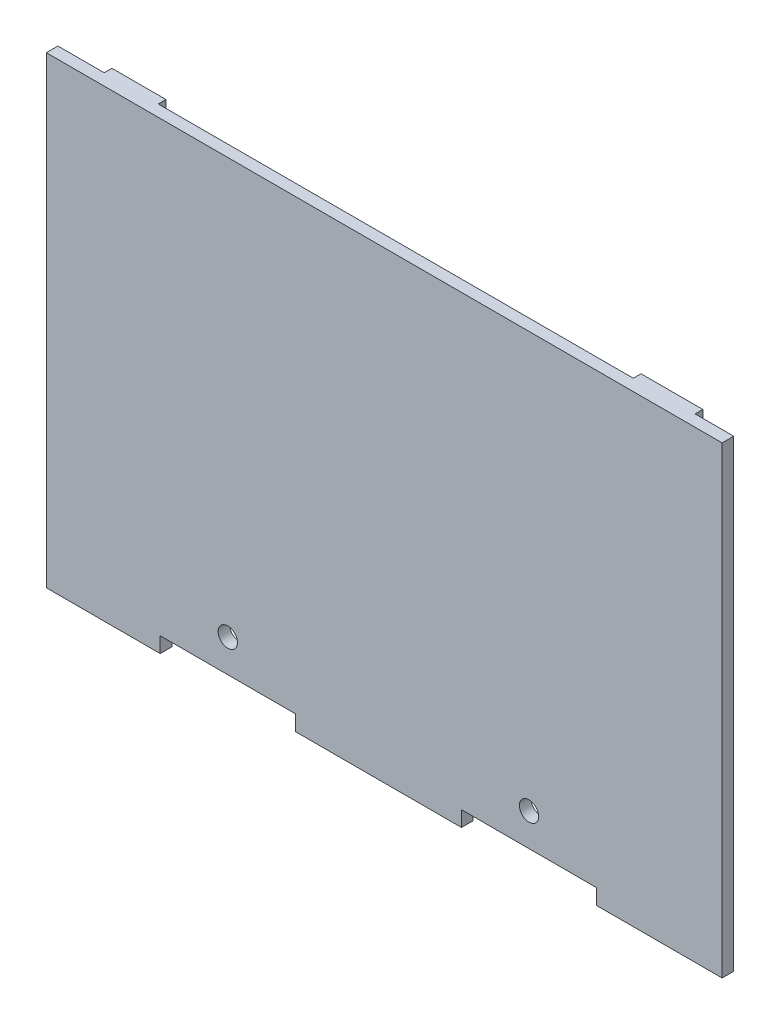
ISO-10303-21;
HEADER;
FILE_DESCRIPTION(('STEP AP214'),'2;1');
FILE_NAME('part.step','',(''),(''),'','','');
FILE_SCHEMA(('AUTOMOTIVE_DESIGN { 1 0 10303 214 1 1 1 1 }'));
ENDSEC;
DATA;
#1=APPLICATION_CONTEXT('core data for automotive mechanical design processes');
#2=APPLICATION_PROTOCOL_DEFINITION('international standard','automotive_design',2000,#1);
#3=PRODUCT_CONTEXT('',#1,'mechanical');
#4=PRODUCT('Part','Part','',(#3));
#5=PRODUCT_RELATED_PRODUCT_CATEGORY('part','',(#4));
#6=PRODUCT_DEFINITION_FORMATION('','',#4);
#7=PRODUCT_DEFINITION_CONTEXT('part definition',#1,'design');
#8=PRODUCT_DEFINITION('design','',#6,#7);
#9=PRODUCT_DEFINITION_SHAPE('','',#8);
#10=(LENGTH_UNIT() NAMED_UNIT(*) SI_UNIT(.MILLI.,.METRE.));
#11=(NAMED_UNIT(*) PLANE_ANGLE_UNIT() SI_UNIT($,.RADIAN.));
#12=(NAMED_UNIT(*) SI_UNIT($,.STERADIAN.) SOLID_ANGLE_UNIT());
#13=UNCERTAINTY_MEASURE_WITH_UNIT(LENGTH_MEASURE(1.E-05),#10,'distance_accuracy_value','');
#14=(GEOMETRIC_REPRESENTATION_CONTEXT(3) GLOBAL_UNCERTAINTY_ASSIGNED_CONTEXT((#13)) GLOBAL_UNIT_ASSIGNED_CONTEXT((#10,
#11,#12)) REPRESENTATION_CONTEXT('',''));
#15=CARTESIAN_POINT('',(0.,0.,0.));
#16=DIRECTION('',(0.,0.,1.));
#17=DIRECTION('',(1.,0.,0.));
#18=AXIS2_PLACEMENT_3D('',#15,#16,#17);
#19=CARTESIAN_POINT('',(0.,0.,0.));
#20=DIRECTION('',(0.,0.,-1.));
#21=DIRECTION('',(-1.,0.,0.));
#22=AXIS2_PLACEMENT_3D('',#19,#20,#21);
#23=PLANE('',#22);
#24=CARTESIAN_POINT('',(47.,-107.55,0.));
#25=DIRECTION('',(0.,0.,-1.));
#26=DIRECTION('',(-1.,0.,0.));
#27=AXIS2_PLACEMENT_3D('',#24,#25,#26);
#28=CIRCLE('',#27,2.5);
#29=CARTESIAN_POINT('',(44.5,-107.55,0.));
#30=VERTEX_POINT('',#29);
#31=EDGE_CURVE('E195',#30,#30,#28,.T.);
#32=ORIENTED_EDGE('',*,*,#31,.F.);
#33=EDGE_LOOP('',(#32));
#34=FACE_BOUND('',#33,.T.);
#35=CARTESIAN_POINT('',(125.,-107.55,0.));
#36=DIRECTION('',(0.,0.,-1.));
#37=DIRECTION('',(-1.,0.,0.));
#38=AXIS2_PLACEMENT_3D('',#35,#36,#37);
#39=CIRCLE('',#38,2.5);
#40=CARTESIAN_POINT('',(122.5,-107.55,0.));
#41=VERTEX_POINT('',#40);
#42=EDGE_CURVE('E198',#41,#41,#39,.T.);
#43=ORIENTED_EDGE('',*,*,#42,.F.);
#44=EDGE_LOOP('',(#43));
#45=FACE_BOUND('',#44,.T.);
#46=DIRECTION('',(0.,1.,0.));
#47=VECTOR('',#46,1.);
#48=CARTESIAN_POINT('',(149.,0.,0.));
#49=LINE('',#48,#47);
#50=CARTESIAN_POINT('',(149.,-120.,0.));
#51=VERTEX_POINT('',#50);
#52=CARTESIAN_POINT('',(149.,0.,0.));
#53=VERTEX_POINT('',#52);
#54=EDGE_CURVE('E11',#51,#53,#49,.T.);
#55=ORIENTED_EDGE('',*,*,#54,.F.);
#56=DIRECTION('',(1.,0.,0.));
#57=VECTOR('',#56,1.);
#58=CARTESIAN_POINT('',(175.,-120.,0.));
#59=LINE('',#58,#57);
#60=CARTESIAN_POINT('',(142.5,-120.,0.));
#61=VERTEX_POINT('',#60);
#62=EDGE_CURVE('E176',#61,#51,#59,.T.);
#63=ORIENTED_EDGE('',*,*,#62,.F.);
#64=DIRECTION('',(0.,-1.,0.));
#65=VECTOR('',#64,1.);
#66=CARTESIAN_POINT('',(142.5,-120.,0.));
#67=LINE('',#66,#65);
#68=CARTESIAN_POINT('',(142.5,-116.,0.));
#69=VERTEX_POINT('',#68);
#70=EDGE_CURVE('E274',#69,#61,#67,.T.);
#71=ORIENTED_EDGE('',*,*,#70,.F.);
#72=DIRECTION('',(1.,0.,0.));
#73=VECTOR('',#72,1.);
#74=CARTESIAN_POINT('',(142.5,-116.,0.));
#75=LINE('',#74,#73);
#76=CARTESIAN_POINT('',(107.5,-116.,0.));
#77=VERTEX_POINT('',#76);
#78=EDGE_CURVE('E272',#77,#69,#75,.T.);
#79=ORIENTED_EDGE('',*,*,#78,.F.);
#80=DIRECTION('',(0.,1.,0.));
#81=VECTOR('',#80,1.);
#82=CARTESIAN_POINT('',(107.5,-116.,0.));
#83=LINE('',#82,#81);
#84=CARTESIAN_POINT('',(107.5,-120.,0.));
#85=VERTEX_POINT('',#84);
#86=EDGE_CURVE('E270',#85,#77,#83,.T.);
#87=ORIENTED_EDGE('',*,*,#86,.F.);
#88=DIRECTION('',(1.,0.,0.));
#89=VECTOR('',#88,1.);
#90=CARTESIAN_POINT('',(107.5,-120.,0.));
#91=LINE('',#90,#89);
#92=CARTESIAN_POINT('',(64.5,-120.,0.));
#93=VERTEX_POINT('',#92);
#94=EDGE_CURVE('E268',#93,#85,#91,.T.);
#95=ORIENTED_EDGE('',*,*,#94,.F.);
#96=DIRECTION('',(0.,-1.,0.));
#97=VECTOR('',#96,1.);
#98=CARTESIAN_POINT('',(64.5,-120.,0.));
#99=LINE('',#98,#97);
#100=CARTESIAN_POINT('',(64.5,-116.,0.));
#101=VERTEX_POINT('',#100);
#102=EDGE_CURVE('E266',#101,#93,#99,.T.);
#103=ORIENTED_EDGE('',*,*,#102,.F.);
#104=DIRECTION('',(1.,0.,0.));
#105=VECTOR('',#104,1.);
#106=CARTESIAN_POINT('',(64.5,-116.,0.));
#107=LINE('',#106,#105);
#108=CARTESIAN_POINT('',(29.5,-116.,0.));
#109=VERTEX_POINT('',#108);
#110=EDGE_CURVE('E264',#109,#101,#107,.T.);
#111=ORIENTED_EDGE('',*,*,#110,.F.);
#112=DIRECTION('',(0.,1.,0.));
#113=VECTOR('',#112,1.);
#114=CARTESIAN_POINT('',(29.5,-116.,0.));
#115=LINE('',#114,#113);
#116=CARTESIAN_POINT('',(29.5,-120.,0.));
#117=VERTEX_POINT('',#116);
#118=EDGE_CURVE('E262',#117,#109,#115,.T.);
#119=ORIENTED_EDGE('',*,*,#118,.F.);
#120=DIRECTION('',(1.,0.,0.));
#121=VECTOR('',#120,1.);
#122=CARTESIAN_POINT('',(29.5,-120.,0.));
#123=LINE('',#122,#121);
#124=CARTESIAN_POINT('',(26.,-120.,0.));
#125=VERTEX_POINT('',#124);
#126=EDGE_CURVE('E258',#125,#117,#123,.T.);
#127=ORIENTED_EDGE('',*,*,#126,.F.);
#128=DIRECTION('',(0.,-1.,0.));
#129=VECTOR('',#128,1.);
#130=CARTESIAN_POINT('',(26.,0.,0.));
#131=LINE('',#130,#129);
#132=CARTESIAN_POINT('',(26.,0.,0.));
#133=VERTEX_POINT('',#132);
#134=EDGE_CURVE('E318',#133,#125,#131,.T.);
#135=ORIENTED_EDGE('',*,*,#134,.F.);
#136=DIRECTION('',(-1.,0.,0.));
#137=VECTOR('',#136,1.);
#138=CARTESIAN_POINT('',(0.,0.,0.));
#139=LINE('',#138,#137);
#140=EDGE_CURVE('E283',#53,#133,#139,.T.);
#141=ORIENTED_EDGE('',*,*,#140,.F.);
#142=EDGE_LOOP('',(#55,#63,#71,#79,#87,#95,#103,#111,#119,#127,#135,#141));
#143=FACE_BOUND('',#142,.T.);
#144=ADVANCED_FACE('F35',(#34,#45,#143),#23,.T.);
#145=DIRECTION('',(0.,1.,0.));
#146=VECTOR('',#145,1.);
#147=CARTESIAN_POINT('',(12.,0.,0.));
#148=LINE('',#147,#146);
#149=CARTESIAN_POINT('',(12.,-120.,0.));
#150=VERTEX_POINT('',#149);
#151=CARTESIAN_POINT('',(12.,0.,0.));
#152=VERTEX_POINT('',#151);
#153=EDGE_CURVE('E320',#150,#152,#148,.T.);
#154=ORIENTED_EDGE('',*,*,#153,.F.);
#155=CARTESIAN_POINT('',(0.,-120.,0.));
#156=VERTEX_POINT('',#155);
#157=EDGE_CURVE('E259',#156,#150,#123,.T.);
#158=ORIENTED_EDGE('',*,*,#157,.F.);
#159=DIRECTION('',(0.,-1.,0.));
#160=VECTOR('',#159,1.);
#161=CARTESIAN_POINT('',(0.,-120.,0.));
#162=LINE('',#161,#160);
#163=CARTESIAN_POINT('',(0.,0.,0.));
#164=VERTEX_POINT('',#163);
#165=EDGE_CURVE('E223',#164,#156,#162,.T.);
#166=ORIENTED_EDGE('',*,*,#165,.F.);
#167=EDGE_CURVE('E280',#152,#164,#139,.T.);
#168=ORIENTED_EDGE('',*,*,#167,.F.);
#169=EDGE_LOOP('',(#154,#158,#166,#168));
#170=FACE_BOUND('',#169,.T.);
#171=ADVANCED_FACE('F395',(#170),#23,.T.);
#172=CARTESIAN_POINT('',(0.,-120.,3.));
#173=DIRECTION('',(1.,0.,0.));
#174=DIRECTION('',(0.,0.,-1.));
#175=AXIS2_PLACEMENT_3D('',#172,#173,#174);
#176=PLANE('',#175);
#177=ORIENTED_EDGE('',*,*,#165,.T.);
#178=DIRECTION('',(0.,0.,-1.));
#179=VECTOR('',#178,1.);
#180=CARTESIAN_POINT('',(0.,-120.,3.));
#181=LINE('',#180,#179);
#182=CARTESIAN_POINT('',(0.,-120.,3.));
#183=VERTEX_POINT('',#182);
#184=EDGE_CURVE('E315',#183,#156,#181,.T.);
#185=ORIENTED_EDGE('',*,*,#184,.F.);
#186=DIRECTION('',(0.,-1.,0.));
#187=VECTOR('',#186,1.);
#188=CARTESIAN_POINT('',(0.,-120.,3.));
#189=LINE('',#188,#187);
#190=CARTESIAN_POINT('',(0.,0.,3.));
#191=VERTEX_POINT('',#190);
#192=EDGE_CURVE('E229',#191,#183,#189,.T.);
#193=ORIENTED_EDGE('',*,*,#192,.F.);
#194=DIRECTION('',(0.,0.,-1.));
#195=VECTOR('',#194,1.);
#196=CARTESIAN_POINT('',(0.,0.,3.));
#197=LINE('',#196,#195);
#198=EDGE_CURVE('E255',#191,#164,#197,.T.);
#199=ORIENTED_EDGE('',*,*,#198,.T.);
#200=EDGE_LOOP('',(#177,#185,#193,#199));
#201=FACE_BOUND('',#200,.T.);
#202=ADVANCED_FACE('F37',(#201),#176,.F.);
#203=CARTESIAN_POINT('',(29.5,-120.,3.));
#204=DIRECTION('',(0.,1.,0.));
#205=DIRECTION('',(-1.,0.,0.));
#206=AXIS2_PLACEMENT_3D('',#203,#204,#205);
#207=PLANE('',#206);
#208=DIRECTION('',(0.,0.,-1.));
#209=VECTOR('',#208,1.);
#210=CARTESIAN_POINT('',(29.5,-120.,3.));
#211=LINE('',#210,#209);
#212=CARTESIAN_POINT('',(29.5,-120.,3.));
#213=VERTEX_POINT('',#212);
#214=EDGE_CURVE('E312',#213,#117,#211,.T.);
#215=ORIENTED_EDGE('',*,*,#214,.F.);
#216=DIRECTION('',(1.,0.,0.));
#217=VECTOR('',#216,1.);
#218=CARTESIAN_POINT('',(29.5,-120.,3.));
#219=LINE('',#218,#217);
#220=EDGE_CURVE('E232',#183,#213,#219,.T.);
#221=ORIENTED_EDGE('',*,*,#220,.F.);
#222=ORIENTED_EDGE('',*,*,#184,.T.);
#223=ORIENTED_EDGE('',*,*,#157,.T.);
#224=DIRECTION('',(0.,0.,1.));
#225=VECTOR('',#224,1.);
#226=CARTESIAN_POINT('',(12.,-120.,-2.));
#227=LINE('',#226,#225);
#228=CARTESIAN_POINT('',(12.,-120.,-2.));
#229=VERTEX_POINT('',#228);
#230=EDGE_CURVE('E219',#229,#150,#227,.T.);
#231=ORIENTED_EDGE('',*,*,#230,.F.);
#232=DIRECTION('',(1.,0.,0.));
#233=VECTOR('',#232,1.);
#234=CARTESIAN_POINT('',(12.,-120.,-2.));
#235=LINE('',#234,#233);
#236=CARTESIAN_POINT('',(26.,-120.,-2.));
#237=VERTEX_POINT('',#236);
#238=EDGE_CURVE('E211',#229,#237,#235,.T.);
#239=ORIENTED_EDGE('',*,*,#238,.T.);
#240=DIRECTION('',(0.,0.,1.));
#241=VECTOR('',#240,1.);
#242=CARTESIAN_POINT('',(26.,-120.,-2.));
#243=LINE('',#242,#241);
#244=EDGE_CURVE('E58',#237,#125,#243,.T.);
#245=ORIENTED_EDGE('',*,*,#244,.T.);
#246=ORIENTED_EDGE('',*,*,#126,.T.);
#247=EDGE_LOOP('',(#215,#221,#222,#223,#231,#239,#245,#246));
#248=FACE_BOUND('',#247,.T.);
#249=ADVANCED_FACE('F356',(#248),#207,.F.);
#250=CARTESIAN_POINT('',(29.5,-116.,3.));
#251=DIRECTION('',(-1.,0.,0.));
#252=DIRECTION('',(0.,0.,1.));
#253=AXIS2_PLACEMENT_3D('',#250,#251,#252);
#254=PLANE('',#253);
#255=ORIENTED_EDGE('',*,*,#118,.T.);
#256=DIRECTION('',(0.,0.,-1.));
#257=VECTOR('',#256,1.);
#258=CARTESIAN_POINT('',(29.5,-116.,3.));
#259=LINE('',#258,#257);
#260=CARTESIAN_POINT('',(29.5,-116.,3.));
#261=VERTEX_POINT('',#260);
#262=EDGE_CURVE('E309',#261,#109,#259,.T.);
#263=ORIENTED_EDGE('',*,*,#262,.F.);
#264=DIRECTION('',(0.,1.,0.));
#265=VECTOR('',#264,1.);
#266=CARTESIAN_POINT('',(29.5,-116.,3.));
#267=LINE('',#266,#265);
#268=EDGE_CURVE('E235',#213,#261,#267,.T.);
#269=ORIENTED_EDGE('',*,*,#268,.F.);
#270=ORIENTED_EDGE('',*,*,#214,.T.);
#271=EDGE_LOOP('',(#255,#263,#269,#270));
#272=FACE_BOUND('',#271,.T.);
#273=ADVANCED_FACE('F360',(#272),#254,.F.);
#274=CARTESIAN_POINT('',(64.5,-116.,3.));
#275=DIRECTION('',(0.,1.,0.));
#276=DIRECTION('',(0.,0.,1.));
#277=AXIS2_PLACEMENT_3D('',#274,#275,#276);
#278=PLANE('',#277);
#279=ORIENTED_EDGE('',*,*,#110,.T.);
#280=DIRECTION('',(0.,0.,-1.));
#281=VECTOR('',#280,1.);
#282=CARTESIAN_POINT('',(64.5,-116.,3.));
#283=LINE('',#282,#281);
#284=CARTESIAN_POINT('',(64.5,-116.,3.));
#285=VERTEX_POINT('',#284);
#286=EDGE_CURVE('E306',#285,#101,#283,.T.);
#287=ORIENTED_EDGE('',*,*,#286,.F.);
#288=DIRECTION('',(1.,0.,0.));
#289=VECTOR('',#288,1.);
#290=CARTESIAN_POINT('',(64.5,-116.,3.));
#291=LINE('',#290,#289);
#292=EDGE_CURVE('E237',#261,#285,#291,.T.);
#293=ORIENTED_EDGE('',*,*,#292,.F.);
#294=ORIENTED_EDGE('',*,*,#262,.T.);
#295=EDGE_LOOP('',(#279,#287,#293,#294));
#296=FACE_BOUND('',#295,.T.);
#297=ADVANCED_FACE('F365',(#296),#278,.F.);
#298=CARTESIAN_POINT('',(64.5,-120.,3.));
#299=DIRECTION('',(1.,0.,0.));
#300=DIRECTION('',(0.,0.,-1.));
#301=AXIS2_PLACEMENT_3D('',#298,#299,#300);
#302=PLANE('',#301);
#303=ORIENTED_EDGE('',*,*,#102,.T.);
#304=DIRECTION('',(0.,0.,-1.));
#305=VECTOR('',#304,1.);
#306=CARTESIAN_POINT('',(64.5,-120.,3.));
#307=LINE('',#306,#305);
#308=CARTESIAN_POINT('',(64.5,-120.,3.));
#309=VERTEX_POINT('',#308);
#310=EDGE_CURVE('E303',#309,#93,#307,.T.);
#311=ORIENTED_EDGE('',*,*,#310,.F.);
#312=DIRECTION('',(0.,-1.,0.));
#313=VECTOR('',#312,1.);
#314=CARTESIAN_POINT('',(64.5,-120.,3.));
#315=LINE('',#314,#313);
#316=EDGE_CURVE('E239',#285,#309,#315,.T.);
#317=ORIENTED_EDGE('',*,*,#316,.F.);
#318=ORIENTED_EDGE('',*,*,#286,.T.);
#319=EDGE_LOOP('',(#303,#311,#317,#318));
#320=FACE_BOUND('',#319,.T.);
#321=ADVANCED_FACE('F371',(#320),#302,.F.);
#322=CARTESIAN_POINT('',(107.5,-120.,3.));
#323=DIRECTION('',(0.,1.,0.));
#324=DIRECTION('',(0.,0.,1.));
#325=AXIS2_PLACEMENT_3D('',#322,#323,#324);
#326=PLANE('',#325);
#327=ORIENTED_EDGE('',*,*,#94,.T.);
#328=DIRECTION('',(0.,0.,-1.));
#329=VECTOR('',#328,1.);
#330=CARTESIAN_POINT('',(107.5,-120.,3.));
#331=LINE('',#330,#329);
#332=CARTESIAN_POINT('',(107.5,-120.,3.));
#333=VERTEX_POINT('',#332);
#334=EDGE_CURVE('E300',#333,#85,#331,.T.);
#335=ORIENTED_EDGE('',*,*,#334,.F.);
#336=DIRECTION('',(1.,0.,0.));
#337=VECTOR('',#336,1.);
#338=CARTESIAN_POINT('',(107.5,-120.,3.));
#339=LINE('',#338,#337);
#340=EDGE_CURVE('E241',#309,#333,#339,.T.);
#341=ORIENTED_EDGE('',*,*,#340,.F.);
#342=ORIENTED_EDGE('',*,*,#310,.T.);
#343=EDGE_LOOP('',(#327,#335,#341,#342));
#344=FACE_BOUND('',#343,.T.);
#345=ADVANCED_FACE('F375',(#344),#326,.F.);
#346=CARTESIAN_POINT('',(107.5,-116.,3.));
#347=DIRECTION('',(-1.,0.,0.));
#348=DIRECTION('',(0.,0.,1.));
#349=AXIS2_PLACEMENT_3D('',#346,#347,#348);
#350=PLANE('',#349);
#351=ORIENTED_EDGE('',*,*,#86,.T.);
#352=DIRECTION('',(0.,0.,-1.));
#353=VECTOR('',#352,1.);
#354=CARTESIAN_POINT('',(107.5,-116.,3.));
#355=LINE('',#354,#353);
#356=CARTESIAN_POINT('',(107.5,-116.,3.));
#357=VERTEX_POINT('',#356);
#358=EDGE_CURVE('E297',#357,#77,#355,.T.);
#359=ORIENTED_EDGE('',*,*,#358,.F.);
#360=DIRECTION('',(0.,1.,0.));
#361=VECTOR('',#360,1.);
#362=CARTESIAN_POINT('',(107.5,-116.,3.));
#363=LINE('',#362,#361);
#364=EDGE_CURVE('E243',#333,#357,#363,.T.);
#365=ORIENTED_EDGE('',*,*,#364,.F.);
#366=ORIENTED_EDGE('',*,*,#334,.T.);
#367=EDGE_LOOP('',(#351,#359,#365,#366));
#368=FACE_BOUND('',#367,.T.);
#369=ADVANCED_FACE('F380',(#368),#350,.F.);
#370=CARTESIAN_POINT('',(142.5,-116.,3.));
#371=DIRECTION('',(0.,1.,0.));
#372=DIRECTION('',(0.,0.,1.));
#373=AXIS2_PLACEMENT_3D('',#370,#371,#372);
#374=PLANE('',#373);
#375=ORIENTED_EDGE('',*,*,#78,.T.);
#376=DIRECTION('',(0.,0.,-1.));
#377=VECTOR('',#376,1.);
#378=CARTESIAN_POINT('',(142.5,-116.,3.));
#379=LINE('',#378,#377);
#380=CARTESIAN_POINT('',(142.5,-116.,3.));
#381=VERTEX_POINT('',#380);
#382=EDGE_CURVE('E294',#381,#69,#379,.T.);
#383=ORIENTED_EDGE('',*,*,#382,.F.);
#384=DIRECTION('',(1.,0.,0.));
#385=VECTOR('',#384,1.);
#386=CARTESIAN_POINT('',(142.5,-116.,3.));
#387=LINE('',#386,#385);
#388=EDGE_CURVE('E245',#357,#381,#387,.T.);
#389=ORIENTED_EDGE('',*,*,#388,.F.);
#390=ORIENTED_EDGE('',*,*,#358,.T.);
#391=EDGE_LOOP('',(#375,#383,#389,#390));
#392=FACE_BOUND('',#391,.T.);
#393=ADVANCED_FACE('F384',(#392),#374,.F.);
#394=CARTESIAN_POINT('',(142.5,-120.,3.));
#395=DIRECTION('',(1.,0.,0.));
#396=DIRECTION('',(0.,0.,-1.));
#397=AXIS2_PLACEMENT_3D('',#394,#395,#396);
#398=PLANE('',#397);
#399=ORIENTED_EDGE('',*,*,#70,.T.);
#400=DIRECTION('',(0.,0.,-1.));
#401=VECTOR('',#400,1.);
#402=CARTESIAN_POINT('',(142.5,-120.,3.));
#403=LINE('',#402,#401);
#404=CARTESIAN_POINT('',(142.5,-120.,3.));
#405=VERTEX_POINT('',#404);
#406=EDGE_CURVE('E292',#405,#61,#403,.T.);
#407=ORIENTED_EDGE('',*,*,#406,.F.);
#408=DIRECTION('',(0.,-1.,0.));
#409=VECTOR('',#408,1.);
#410=CARTESIAN_POINT('',(142.5,-120.,3.));
#411=LINE('',#410,#409);
#412=EDGE_CURVE('E247',#381,#405,#411,.T.);
#413=ORIENTED_EDGE('',*,*,#412,.F.);
#414=ORIENTED_EDGE('',*,*,#382,.T.);
#415=EDGE_LOOP('',(#399,#407,#413,#414));
#416=FACE_BOUND('',#415,.T.);
#417=ADVANCED_FACE('F385',(#416),#398,.F.);
#418=CARTESIAN_POINT('',(175.,-120.,3.));
#419=DIRECTION('',(0.,1.,0.));
#420=DIRECTION('',(-1.,0.,0.));
#421=AXIS2_PLACEMENT_3D('',#418,#419,#420);
#422=PLANE('',#421);
#423=DIRECTION('',(0.,0.,-1.));
#424=VECTOR('',#423,1.);
#425=CARTESIAN_POINT('',(175.,-120.,3.));
#426=LINE('',#425,#424);
#427=CARTESIAN_POINT('',(175.,-120.,3.));
#428=VERTEX_POINT('',#427);
#429=CARTESIAN_POINT('',(175.,-120.,0.));
#430=VERTEX_POINT('',#429);
#431=EDGE_CURVE('E289',#428,#430,#426,.T.);
#432=ORIENTED_EDGE('',*,*,#431,.F.);
#433=DIRECTION('',(1.,0.,0.));
#434=VECTOR('',#433,1.);
#435=CARTESIAN_POINT('',(175.,-120.,3.));
#436=LINE('',#435,#434);
#437=EDGE_CURVE('E249',#405,#428,#436,.T.);
#438=ORIENTED_EDGE('',*,*,#437,.F.);
#439=ORIENTED_EDGE('',*,*,#406,.T.);
#440=ORIENTED_EDGE('',*,*,#62,.T.);
#441=DIRECTION('',(0.,0.,1.));
#442=VECTOR('',#441,1.);
#443=CARTESIAN_POINT('',(149.,-120.,-2.));
#444=LINE('',#443,#442);
#445=CARTESIAN_POINT('',(149.,-120.,-2.));
#446=VERTEX_POINT('',#445);
#447=EDGE_CURVE('E169',#446,#51,#444,.T.);
#448=ORIENTED_EDGE('',*,*,#447,.F.);
#449=DIRECTION('',(1.,0.,0.));
#450=VECTOR('',#449,1.);
#451=CARTESIAN_POINT('',(149.,-120.,-2.));
#452=LINE('',#451,#450);
#453=CARTESIAN_POINT('',(165.,-120.,-2.));
#454=VERTEX_POINT('',#453);
#455=EDGE_CURVE('E173',#446,#454,#452,.T.);
#456=ORIENTED_EDGE('',*,*,#455,.T.);
#457=DIRECTION('',(0.,0.,1.));
#458=VECTOR('',#457,1.);
#459=CARTESIAN_POINT('',(165.,-120.,-2.));
#460=LINE('',#459,#458);
#461=CARTESIAN_POINT('',(165.,-120.,0.));
#462=VERTEX_POINT('',#461);
#463=EDGE_CURVE('E50',#454,#462,#460,.T.);
#464=ORIENTED_EDGE('',*,*,#463,.T.);
#465=EDGE_CURVE('E276',#462,#430,#59,.T.);
#466=ORIENTED_EDGE('',*,*,#465,.T.);
#467=EDGE_LOOP('',(#432,#438,#439,#440,#448,#456,#464,#466));
#468=FACE_BOUND('',#467,.T.);
#469=ADVANCED_FACE('F172',(#468),#422,.F.);
#470=CARTESIAN_POINT('',(175.,0.,3.));
#471=DIRECTION('',(-1.,0.,0.));
#472=DIRECTION('',(0.,-1.,0.));
#473=AXIS2_PLACEMENT_3D('',#470,#471,#472);
#474=PLANE('',#473);
#475=DIRECTION('',(0.,1.,0.));
#476=VECTOR('',#475,1.);
#477=CARTESIAN_POINT('',(175.,0.,0.));
#478=LINE('',#477,#476);
#479=CARTESIAN_POINT('',(175.,0.,0.));
#480=VERTEX_POINT('',#479);
#481=EDGE_CURVE('E278',#430,#480,#478,.T.);
#482=ORIENTED_EDGE('',*,*,#481,.T.);
#483=DIRECTION('',(0.,0.,-1.));
#484=VECTOR('',#483,1.);
#485=CARTESIAN_POINT('',(175.,0.,3.));
#486=LINE('',#485,#484);
#487=CARTESIAN_POINT('',(175.,0.,3.));
#488=VERTEX_POINT('',#487);
#489=EDGE_CURVE('E286',#488,#480,#486,.T.);
#490=ORIENTED_EDGE('',*,*,#489,.F.);
#491=DIRECTION('',(0.,1.,0.));
#492=VECTOR('',#491,1.);
#493=CARTESIAN_POINT('',(175.,0.,3.));
#494=LINE('',#493,#492);
#495=EDGE_CURVE('E251',#428,#488,#494,.T.);
#496=ORIENTED_EDGE('',*,*,#495,.F.);
#497=ORIENTED_EDGE('',*,*,#431,.T.);
#498=EDGE_LOOP('',(#482,#490,#496,#497));
#499=FACE_BOUND('',#498,.T.);
#500=ADVANCED_FACE('F332',(#499),#474,.F.);
#501=CARTESIAN_POINT('',(0.,0.,3.));
#502=DIRECTION('',(0.,-1.,0.));
#503=DIRECTION('',(1.,0.,0.));
#504=AXIS2_PLACEMENT_3D('',#501,#502,#503);
#505=PLANE('',#504);
#506=CARTESIAN_POINT('',(165.,0.,0.));
#507=VERTEX_POINT('',#506);
#508=EDGE_CURVE('E233',#480,#507,#139,.T.);
#509=ORIENTED_EDGE('',*,*,#508,.T.);
#510=DIRECTION('',(0.,0.,1.));
#511=VECTOR('',#510,1.);
#512=CARTESIAN_POINT('',(165.,0.,-2.));
#513=LINE('',#512,#511);
#514=CARTESIAN_POINT('',(165.,0.,-2.));
#515=VERTEX_POINT('',#514);
#516=EDGE_CURVE('E206',#515,#507,#513,.T.);
#517=ORIENTED_EDGE('',*,*,#516,.F.);
#518=DIRECTION('',(-1.,0.,0.));
#519=VECTOR('',#518,1.);
#520=CARTESIAN_POINT('',(149.,0.,-2.));
#521=LINE('',#520,#519);
#522=CARTESIAN_POINT('',(149.,0.,-2.));
#523=VERTEX_POINT('',#522);
#524=EDGE_CURVE('E180',#515,#523,#521,.T.);
#525=ORIENTED_EDGE('',*,*,#524,.T.);
#526=DIRECTION('',(0.,0.,1.));
#527=VECTOR('',#526,1.);
#528=CARTESIAN_POINT('',(149.,0.,-2.));
#529=LINE('',#528,#527);
#530=EDGE_CURVE('E194',#523,#53,#529,.T.);
#531=ORIENTED_EDGE('',*,*,#530,.T.);
#532=ORIENTED_EDGE('',*,*,#140,.T.);
#533=DIRECTION('',(0.,0.,1.));
#534=VECTOR('',#533,1.);
#535=CARTESIAN_POINT('',(26.,0.,-2.));
#536=LINE('',#535,#534);
#537=CARTESIAN_POINT('',(26.,0.,-2.));
#538=VERTEX_POINT('',#537);
#539=EDGE_CURVE('E224',#538,#133,#536,.T.);
#540=ORIENTED_EDGE('',*,*,#539,.F.);
#541=DIRECTION('',(-1.,0.,0.));
#542=VECTOR('',#541,1.);
#543=CARTESIAN_POINT('',(12.,0.,-2.));
#544=LINE('',#543,#542);
#545=CARTESIAN_POINT('',(12.,0.,-2.));
#546=VERTEX_POINT('',#545);
#547=EDGE_CURVE('E216',#538,#546,#544,.T.);
#548=ORIENTED_EDGE('',*,*,#547,.T.);
#549=DIRECTION('',(0.,0.,1.));
#550=VECTOR('',#549,1.);
#551=CARTESIAN_POINT('',(12.,0.,-2.));
#552=LINE('',#551,#550);
#553=EDGE_CURVE('E220',#546,#152,#552,.T.);
#554=ORIENTED_EDGE('',*,*,#553,.T.);
#555=ORIENTED_EDGE('',*,*,#167,.T.);
#556=ORIENTED_EDGE('',*,*,#198,.F.);
#557=DIRECTION('',(-1.,0.,0.));
#558=VECTOR('',#557,1.);
#559=CARTESIAN_POINT('',(0.,0.,3.));
#560=LINE('',#559,#558);
#561=EDGE_CURVE('E253',#488,#191,#560,.T.);
#562=ORIENTED_EDGE('',*,*,#561,.F.);
#563=ORIENTED_EDGE('',*,*,#489,.T.);
#564=EDGE_LOOP('',(#509,#517,#525,#531,#532,#540,#548,#554,#555,#556,#562,#563));
#565=FACE_BOUND('',#564,.T.);
#566=ADVANCED_FACE('F347',(#565),#505,.F.);
#567=CARTESIAN_POINT('',(0.,0.,3.));
#568=DIRECTION('',(0.,0.,-1.));
#569=DIRECTION('',(-1.,0.,0.));
#570=AXIS2_PLACEMENT_3D('',#567,#568,#569);
#571=PLANE('',#570);
#572=CARTESIAN_POINT('',(47.,-107.55,3.));
#573=DIRECTION('',(0.,0.,1.));
#574=DIRECTION('',(1.,0.,0.));
#575=AXIS2_PLACEMENT_3D('',#572,#573,#574);
#576=CIRCLE('',#575,2.5);
#577=CARTESIAN_POINT('',(49.5,-107.55,3.));
#578=VERTEX_POINT('',#577);
#579=EDGE_CURVE('E446',#578,#578,#576,.T.);
#580=ORIENTED_EDGE('',*,*,#579,.F.);
#581=EDGE_LOOP('',(#580));
#582=FACE_BOUND('',#581,.T.);
#583=CARTESIAN_POINT('',(125.,-107.55,3.));
#584=DIRECTION('',(0.,0.,1.));
#585=DIRECTION('',(1.,0.,0.));
#586=AXIS2_PLACEMENT_3D('',#583,#584,#585);
#587=CIRCLE('',#586,2.5);
#588=CARTESIAN_POINT('',(127.5,-107.55,3.));
#589=VERTEX_POINT('',#588);
#590=EDGE_CURVE('E447',#589,#589,#587,.T.);
#591=ORIENTED_EDGE('',*,*,#590,.F.);
#592=EDGE_LOOP('',(#591));
#593=FACE_BOUND('',#592,.T.);
#594=ORIENTED_EDGE('',*,*,#561,.T.);
#595=ORIENTED_EDGE('',*,*,#192,.T.);
#596=ORIENTED_EDGE('',*,*,#220,.T.);
#597=ORIENTED_EDGE('',*,*,#268,.T.);
#598=ORIENTED_EDGE('',*,*,#292,.T.);
#599=ORIENTED_EDGE('',*,*,#316,.T.);
#600=ORIENTED_EDGE('',*,*,#340,.T.);
#601=ORIENTED_EDGE('',*,*,#364,.T.);
#602=ORIENTED_EDGE('',*,*,#388,.T.);
#603=ORIENTED_EDGE('',*,*,#412,.T.);
#604=ORIENTED_EDGE('',*,*,#437,.T.);
#605=ORIENTED_EDGE('',*,*,#495,.T.);
#606=EDGE_LOOP('',(#594,#595,#596,#597,#598,#599,#600,#601,#602,#603,#604,#605));
#607=FACE_BOUND('',#606,.T.);
#608=ADVANCED_FACE('F336',(#582,#593,#607),#571,.F.);
#609=DIRECTION('',(0.,-1.,0.));
#610=VECTOR('',#609,1.);
#611=CARTESIAN_POINT('',(165.,0.,0.));
#612=LINE('',#611,#610);
#613=EDGE_CURVE('E43',#507,#462,#612,.T.);
#614=ORIENTED_EDGE('',*,*,#613,.F.);
#615=ORIENTED_EDGE('',*,*,#508,.F.);
#616=ORIENTED_EDGE('',*,*,#481,.F.);
#617=ORIENTED_EDGE('',*,*,#465,.F.);
#618=EDGE_LOOP('',(#614,#615,#616,#617));
#619=FACE_BOUND('',#618,.T.);
#620=ADVANCED_FACE('F328',(#619),#23,.T.);
#621=CARTESIAN_POINT('',(12.,0.,-2.));
#622=DIRECTION('',(-1.,0.,0.));
#623=DIRECTION('',(0.,-1.,0.));
#624=AXIS2_PLACEMENT_3D('',#621,#622,#623);
#625=PLANE('',#624);
#626=ORIENTED_EDGE('',*,*,#230,.T.);
#627=ORIENTED_EDGE('',*,*,#153,.T.);
#628=ORIENTED_EDGE('',*,*,#553,.F.);
#629=DIRECTION('',(0.,-1.,0.));
#630=VECTOR('',#629,1.);
#631=CARTESIAN_POINT('',(12.,0.,-2.));
#632=LINE('',#631,#630);
#633=EDGE_CURVE('E205',#546,#229,#632,.T.);
#634=ORIENTED_EDGE('',*,*,#633,.T.);
#635=EDGE_LOOP('',(#626,#627,#628,#634));
#636=FACE_BOUND('',#635,.T.);
#637=ADVANCED_FACE('F407',(#636),#625,.T.);
#638=CARTESIAN_POINT('',(26.,0.,-2.));
#639=DIRECTION('',(1.,0.,0.));
#640=DIRECTION('',(0.,1.,0.));
#641=AXIS2_PLACEMENT_3D('',#638,#639,#640);
#642=PLANE('',#641);
#643=ORIENTED_EDGE('',*,*,#539,.T.);
#644=ORIENTED_EDGE('',*,*,#134,.T.);
#645=ORIENTED_EDGE('',*,*,#244,.F.);
#646=DIRECTION('',(0.,1.,0.));
#647=VECTOR('',#646,1.);
#648=CARTESIAN_POINT('',(26.,0.,-2.));
#649=LINE('',#648,#647);
#650=EDGE_CURVE('E213',#237,#538,#649,.T.);
#651=ORIENTED_EDGE('',*,*,#650,.T.);
#652=EDGE_LOOP('',(#643,#644,#645,#651));
#653=FACE_BOUND('',#652,.T.);
#654=ADVANCED_FACE('F412',(#653),#642,.T.);
#655=CARTESIAN_POINT('',(0.,0.,-2.));
#656=DIRECTION('',(0.,0.,1.));
#657=DIRECTION('',(1.,0.,0.));
#658=AXIS2_PLACEMENT_3D('',#655,#656,#657);
#659=PLANE('',#658);
#660=ORIENTED_EDGE('',*,*,#633,.F.);
#661=ORIENTED_EDGE('',*,*,#547,.F.);
#662=ORIENTED_EDGE('',*,*,#650,.F.);
#663=ORIENTED_EDGE('',*,*,#238,.F.);
#664=EDGE_LOOP('',(#660,#661,#662,#663));
#665=FACE_BOUND('',#664,.T.);
#666=ADVANCED_FACE('F424',(#665),#659,.F.);
#667=CARTESIAN_POINT('',(149.,0.,-2.));
#668=DIRECTION('',(-1.,0.,0.));
#669=DIRECTION('',(0.,-1.,0.));
#670=AXIS2_PLACEMENT_3D('',#667,#668,#669);
#671=PLANE('',#670);
#672=ORIENTED_EDGE('',*,*,#447,.T.);
#673=ORIENTED_EDGE('',*,*,#54,.T.);
#674=ORIENTED_EDGE('',*,*,#530,.F.);
#675=DIRECTION('',(0.,-1.,0.));
#676=VECTOR('',#675,1.);
#677=CARTESIAN_POINT('',(149.,0.,-2.));
#678=LINE('',#677,#676);
#679=EDGE_CURVE('E187',#523,#446,#678,.T.);
#680=ORIENTED_EDGE('',*,*,#679,.T.);
#681=EDGE_LOOP('',(#672,#673,#674,#680));
#682=FACE_BOUND('',#681,.T.);
#683=ADVANCED_FACE('F192',(#682),#671,.T.);
#684=CARTESIAN_POINT('',(165.,0.,-2.));
#685=DIRECTION('',(1.,0.,0.));
#686=DIRECTION('',(0.,0.,-1.));
#687=AXIS2_PLACEMENT_3D('',#684,#685,#686);
#688=PLANE('',#687);
#689=ORIENTED_EDGE('',*,*,#516,.T.);
#690=ORIENTED_EDGE('',*,*,#613,.T.);
#691=ORIENTED_EDGE('',*,*,#463,.F.);
#692=DIRECTION('',(0.,1.,0.));
#693=VECTOR('',#692,1.);
#694=CARTESIAN_POINT('',(165.,0.,-2.));
#695=LINE('',#694,#693);
#696=EDGE_CURVE('E190',#454,#515,#695,.T.);
#697=ORIENTED_EDGE('',*,*,#696,.T.);
#698=EDGE_LOOP('',(#689,#690,#691,#697));
#699=FACE_BOUND('',#698,.T.);
#700=ADVANCED_FACE('F324',(#699),#688,.T.);
#701=CARTESIAN_POINT('',(0.,0.,-2.));
#702=DIRECTION('',(0.,0.,1.));
#703=DIRECTION('',(1.,0.,0.));
#704=AXIS2_PLACEMENT_3D('',#701,#702,#703);
#705=PLANE('',#704);
#706=ORIENTED_EDGE('',*,*,#679,.F.);
#707=ORIENTED_EDGE('',*,*,#524,.F.);
#708=ORIENTED_EDGE('',*,*,#696,.F.);
#709=ORIENTED_EDGE('',*,*,#455,.F.);
#710=EDGE_LOOP('',(#706,#707,#708,#709));
#711=FACE_BOUND('',#710,.T.);
#712=ADVANCED_FACE('F185',(#711),#705,.F.);
#713=CARTESIAN_POINT('',(125.,-107.55,-7.));
#714=DIRECTION('',(0.,0.,1.));
#715=DIRECTION('',(1.,0.,0.));
#716=AXIS2_PLACEMENT_3D('',#713,#714,#715);
#717=CYLINDRICAL_SURFACE('',#716,2.5);
#718=ORIENTED_EDGE('',*,*,#42,.T.);
#719=EDGE_LOOP('',(#718));
#720=FACE_BOUND('',#719,.T.);
#721=ORIENTED_EDGE('',*,*,#590,.T.);
#722=EDGE_LOOP('',(#721));
#723=FACE_BOUND('',#722,.T.);
#724=ADVANCED_FACE('F435',(#720,#723),#717,.F.);
#725=CARTESIAN_POINT('',(47.,-107.55,-7.));
#726=DIRECTION('',(0.,0.,1.));
#727=DIRECTION('',(1.,0.,0.));
#728=AXIS2_PLACEMENT_3D('',#725,#726,#727);
#729=CYLINDRICAL_SURFACE('',#728,2.5);
#730=ORIENTED_EDGE('',*,*,#31,.T.);
#731=EDGE_LOOP('',(#730));
#732=FACE_BOUND('',#731,.T.);
#733=ORIENTED_EDGE('',*,*,#579,.T.);
#734=EDGE_LOOP('',(#733));
#735=FACE_BOUND('',#734,.T.);
#736=ADVANCED_FACE('F438',(#732,#735),#729,.F.);
#737=CLOSED_SHELL('',(#144,#171,#202,#249,#273,#297,#321,#345,#369,#393,#417,#469,#500,#566,
#608,#620,#637,#654,#666,#683,#700,#712,#724,#736));
#738=MANIFOLD_SOLID_BREP('B2',#737);
#739=ADVANCED_BREP_SHAPE_REPRESENTATION('',(#18,#738),#14);
#740=SHAPE_DEFINITION_REPRESENTATION(#9,#739);
ENDSEC;
END-ISO-10303-21;
